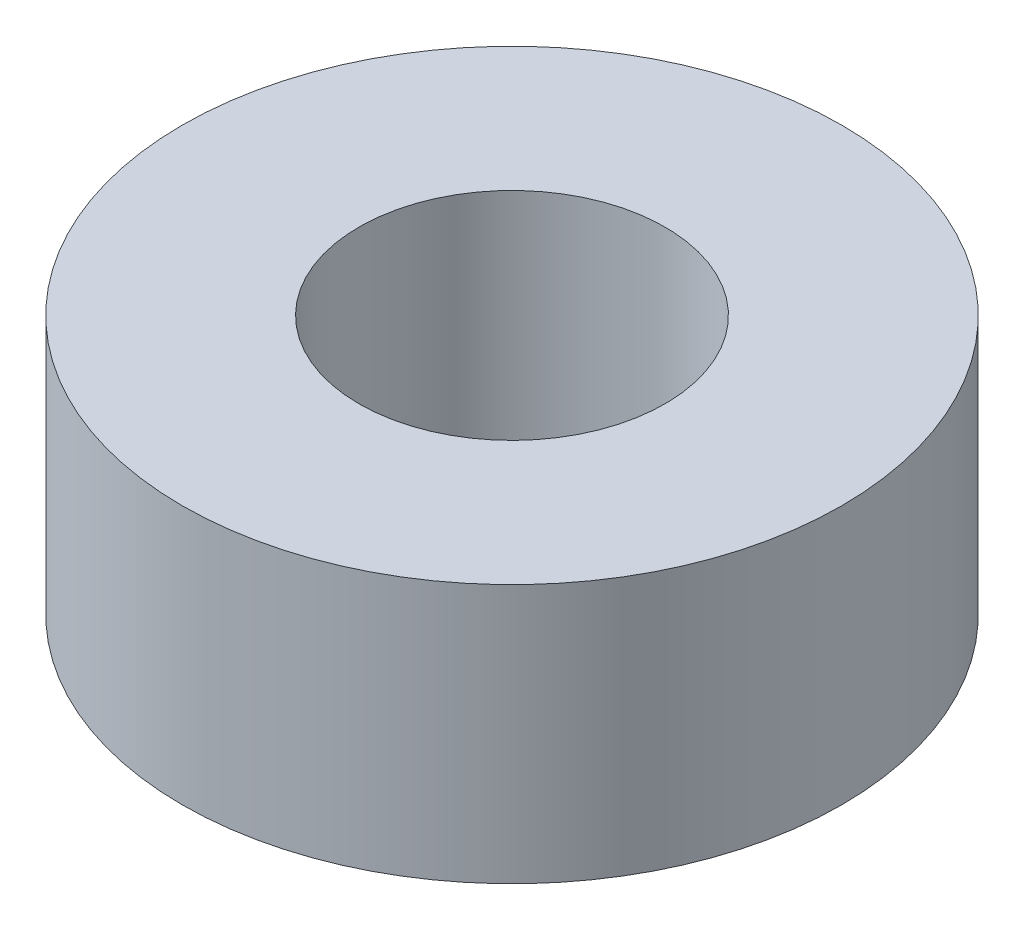
ISO-10303-21;
HEADER;
FILE_DESCRIPTION(('STEP AP214'),'2;1');
FILE_NAME('part.step','',(''),(''),'','','');
FILE_SCHEMA(('AUTOMOTIVE_DESIGN { 1 0 10303 214 1 1 1 1 }'));
ENDSEC;
DATA;
#1=APPLICATION_CONTEXT('core data for automotive mechanical design processes');
#2=APPLICATION_PROTOCOL_DEFINITION('international standard','automotive_design',2000,#1);
#3=PRODUCT_CONTEXT('',#1,'mechanical');
#4=PRODUCT('Part','Part','',(#3));
#5=PRODUCT_RELATED_PRODUCT_CATEGORY('part','',(#4));
#6=PRODUCT_DEFINITION_FORMATION('','',#4);
#7=PRODUCT_DEFINITION_CONTEXT('part definition',#1,'design');
#8=PRODUCT_DEFINITION('design','',#6,#7);
#9=PRODUCT_DEFINITION_SHAPE('','',#8);
#10=(LENGTH_UNIT() NAMED_UNIT(*) SI_UNIT(.MILLI.,.METRE.));
#11=(NAMED_UNIT(*) PLANE_ANGLE_UNIT() SI_UNIT($,.RADIAN.));
#12=(NAMED_UNIT(*) SI_UNIT($,.STERADIAN.) SOLID_ANGLE_UNIT());
#13=UNCERTAINTY_MEASURE_WITH_UNIT(LENGTH_MEASURE(1.E-05),#10,'distance_accuracy_value','');
#14=(GEOMETRIC_REPRESENTATION_CONTEXT(3) GLOBAL_UNCERTAINTY_ASSIGNED_CONTEXT((#13)) GLOBAL_UNIT_ASSIGNED_CONTEXT((#10,
#11,#12)) REPRESENTATION_CONTEXT('',''));
#15=CARTESIAN_POINT('',(0.,0.,0.));
#16=DIRECTION('',(0.,0.,1.));
#17=DIRECTION('',(1.,0.,0.));
#18=AXIS2_PLACEMENT_3D('',#15,#16,#17);
#19=CARTESIAN_POINT('',(0.,2.75,0.));
#20=DIRECTION('',(0.,-1.,0.));
#21=DIRECTION('',(0.,0.,-1.));
#22=AXIS2_PLACEMENT_3D('',#19,#20,#21);
#23=CYLINDRICAL_SURFACE('',#22,1.625);
#24=CARTESIAN_POINT('',(0.,2.75,0.));
#25=DIRECTION('',(0.,1.,0.));
#26=DIRECTION('',(0.,0.,1.));
#27=AXIS2_PLACEMENT_3D('',#24,#25,#26);
#28=CIRCLE('',#27,1.625);
#29=CARTESIAN_POINT('',(0.,2.75,1.625));
#30=VERTEX_POINT('',#29);
#31=EDGE_CURVE('E46',#30,#30,#28,.T.);
#32=ORIENTED_EDGE('',*,*,#31,.T.);
#33=EDGE_LOOP('',(#32));
#34=FACE_BOUND('',#33,.T.);
#35=CARTESIAN_POINT('',(0.,0.,0.));
#36=DIRECTION('',(0.,1.,0.));
#37=DIRECTION('',(0.,0.,1.));
#38=AXIS2_PLACEMENT_3D('',#35,#36,#37);
#39=CIRCLE('',#38,1.625);
#40=CARTESIAN_POINT('',(0.,0.,1.625));
#41=VERTEX_POINT('',#40);
#42=EDGE_CURVE('E52',#41,#41,#39,.T.);
#43=ORIENTED_EDGE('',*,*,#42,.F.);
#44=EDGE_LOOP('',(#43));
#45=FACE_BOUND('',#44,.T.);
#46=ADVANCED_FACE('F39',(#34,#45),#23,.F.);
#47=CARTESIAN_POINT('',(0.,2.75,0.));
#48=DIRECTION('',(0.,-1.,0.));
#49=DIRECTION('',(0.,0.,-1.));
#50=AXIS2_PLACEMENT_3D('',#47,#48,#49);
#51=CYLINDRICAL_SURFACE('',#50,3.5);
#52=CARTESIAN_POINT('',(0.,2.75,0.));
#53=DIRECTION('',(0.,1.,0.));
#54=DIRECTION('',(0.,0.,1.));
#55=AXIS2_PLACEMENT_3D('',#52,#53,#54);
#56=CIRCLE('',#55,3.5);
#57=CARTESIAN_POINT('',(0.,2.75,3.5));
#58=VERTEX_POINT('',#57);
#59=EDGE_CURVE('E10',#58,#58,#56,.T.);
#60=ORIENTED_EDGE('',*,*,#59,.F.);
#61=EDGE_LOOP('',(#60));
#62=FACE_BOUND('',#61,.T.);
#63=CARTESIAN_POINT('',(0.,0.,0.));
#64=DIRECTION('',(0.,1.,0.));
#65=DIRECTION('',(0.,0.,1.));
#66=AXIS2_PLACEMENT_3D('',#63,#64,#65);
#67=CIRCLE('',#66,3.5);
#68=CARTESIAN_POINT('',(0.,0.,3.5));
#69=VERTEX_POINT('',#68);
#70=EDGE_CURVE('E42',#69,#69,#67,.T.);
#71=ORIENTED_EDGE('',*,*,#70,.T.);
#72=EDGE_LOOP('',(#71));
#73=FACE_BOUND('',#72,.T.);
#74=ADVANCED_FACE('F59',(#62,#73),#51,.T.);
#75=CARTESIAN_POINT('',(0.,2.75,0.));
#76=DIRECTION('',(0.,1.,0.));
#77=DIRECTION('',(0.,0.,1.));
#78=AXIS2_PLACEMENT_3D('',#75,#76,#77);
#79=PLANE('',#78);
#80=ORIENTED_EDGE('',*,*,#31,.F.);
#81=EDGE_LOOP('',(#80));
#82=FACE_BOUND('',#81,.T.);
#83=ORIENTED_EDGE('',*,*,#59,.T.);
#84=EDGE_LOOP('',(#83));
#85=FACE_BOUND('',#84,.T.);
#86=ADVANCED_FACE('F63',(#82,#85),#79,.T.);
#87=CARTESIAN_POINT('',(0.,0.,0.));
#88=DIRECTION('',(0.,1.,0.));
#89=DIRECTION('',(0.,0.,1.));
#90=AXIS2_PLACEMENT_3D('',#87,#88,#89);
#91=PLANE('',#90);
#92=ORIENTED_EDGE('',*,*,#42,.T.);
#93=EDGE_LOOP('',(#92));
#94=FACE_BOUND('',#93,.T.);
#95=ORIENTED_EDGE('',*,*,#70,.F.);
#96=EDGE_LOOP('',(#95));
#97=FACE_BOUND('',#96,.T.);
#98=ADVANCED_FACE('F61',(#94,#97),#91,.F.);
#99=CLOSED_SHELL('',(#46,#74,#86,#98));
#100=MANIFOLD_SOLID_BREP('B2',#99);
#101=ADVANCED_BREP_SHAPE_REPRESENTATION('',(#18,#100),#14);
#102=SHAPE_DEFINITION_REPRESENTATION(#9,#101);
ENDSEC;
END-ISO-10303-21;
